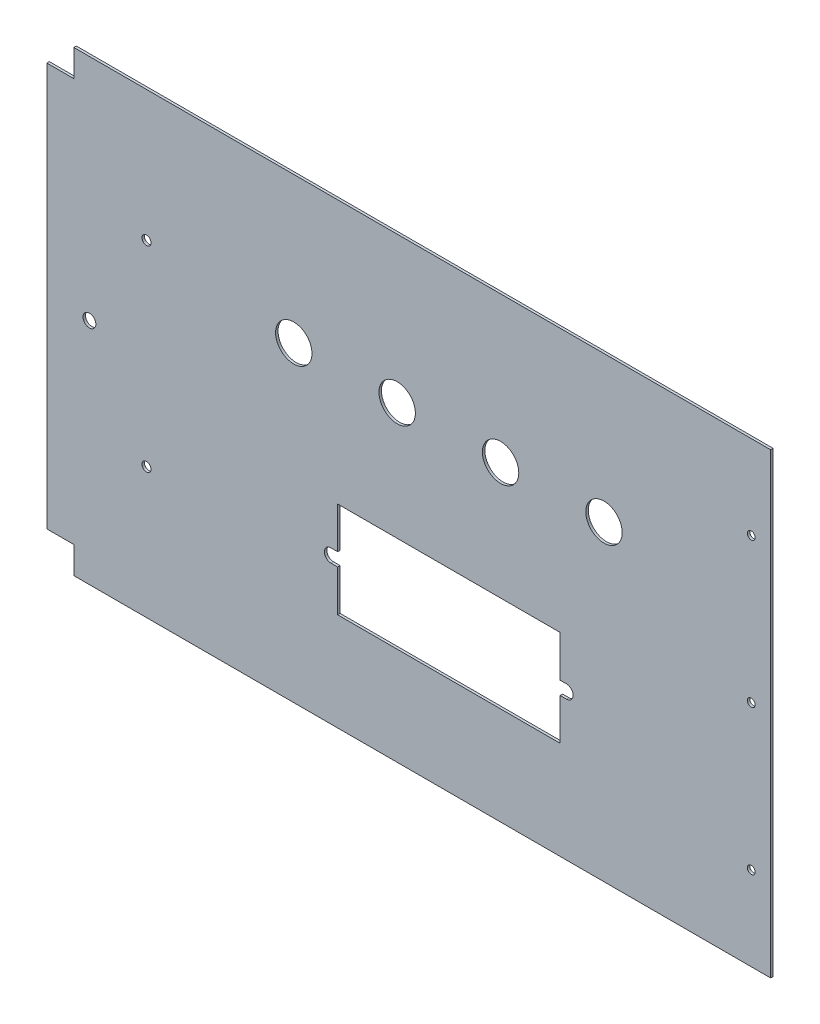
ISO-10303-21;
HEADER;
FILE_DESCRIPTION(('STEP AP214'),'2;1');
FILE_NAME('part.step','',(''),(''),'','','');
FILE_SCHEMA(('AUTOMOTIVE_DESIGN { 1 0 10303 214 1 1 1 1 }'));
ENDSEC;
DATA;
#1=APPLICATION_CONTEXT('core data for automotive mechanical design processes');
#2=APPLICATION_PROTOCOL_DEFINITION('international standard','automotive_design',2000,#1);
#3=PRODUCT_CONTEXT('',#1,'mechanical');
#4=PRODUCT('Part','Part','',(#3));
#5=PRODUCT_RELATED_PRODUCT_CATEGORY('part','',(#4));
#6=PRODUCT_DEFINITION_FORMATION('','',#4);
#7=PRODUCT_DEFINITION_CONTEXT('part definition',#1,'design');
#8=PRODUCT_DEFINITION('design','',#6,#7);
#9=PRODUCT_DEFINITION_SHAPE('','',#8);
#10=(LENGTH_UNIT() NAMED_UNIT(*) SI_UNIT(.MILLI.,.METRE.));
#11=(NAMED_UNIT(*) PLANE_ANGLE_UNIT() SI_UNIT($,.RADIAN.));
#12=(NAMED_UNIT(*) SI_UNIT($,.STERADIAN.) SOLID_ANGLE_UNIT());
#13=UNCERTAINTY_MEASURE_WITH_UNIT(LENGTH_MEASURE(1.E-05),#10,'distance_accuracy_value','');
#14=(GEOMETRIC_REPRESENTATION_CONTEXT(3) GLOBAL_UNCERTAINTY_ASSIGNED_CONTEXT((#13)) GLOBAL_UNIT_ASSIGNED_CONTEXT((#10,
#11,#12)) REPRESENTATION_CONTEXT('',''));
#15=CARTESIAN_POINT('',(0.,0.,0.));
#16=DIRECTION('',(0.,0.,1.));
#17=DIRECTION('',(1.,0.,0.));
#18=AXIS2_PLACEMENT_3D('',#15,#16,#17);
#19=CARTESIAN_POINT('',(-215.519,123.8758,-55.626));
#20=DIRECTION('',(0.,-1.,0.));
#21=DIRECTION('',(0.,0.,-1.));
#22=AXIS2_PLACEMENT_3D('',#19,#20,#21);
#23=PLANE('',#22);
#24=DIRECTION('',(1.,0.,0.));
#25=VECTOR('',#24,1.);
#26=CARTESIAN_POINT('',(0.,123.8758,-1.524));
#27=LINE('',#26,#25);
#28=CARTESIAN_POINT('',(-228.967962531012,123.8758,-1.52399999999989));
#29=VERTEX_POINT('',#28);
#30=CARTESIAN_POINT('',(-212.3948,123.8758,-1.524));
#31=VERTEX_POINT('',#30);
#32=EDGE_CURVE('E258',#29,#31,#27,.T.);
#33=ORIENTED_EDGE('',*,*,#32,.F.);
#34=DIRECTION('',(0.,0.,1.));
#35=VECTOR('',#34,1.);
#36=CARTESIAN_POINT('',(-228.967962531012,123.8758,1.11022302462516E-13));
#37=LINE('',#36,#35);
#38=CARTESIAN_POINT('',(-228.967962531012,123.8758,1.11022302462516E-13));
#39=VERTEX_POINT('',#38);
#40=EDGE_CURVE('E286',#29,#39,#37,.T.);
#41=ORIENTED_EDGE('',*,*,#40,.T.);
#42=DIRECTION('',(1.,0.,0.));
#43=VECTOR('',#42,1.);
#44=CARTESIAN_POINT('',(-215.519,123.8758,0.));
#45=LINE('',#44,#43);
#46=CARTESIAN_POINT('',(-212.3948,123.8758,0.));
#47=VERTEX_POINT('',#46);
#48=EDGE_CURVE('E326',#39,#47,#45,.T.);
#49=ORIENTED_EDGE('',*,*,#48,.T.);
#50=DIRECTION('',(0.,0.,1.));
#51=VECTOR('',#50,1.);
#52=CARTESIAN_POINT('',(-212.3948,123.8758,-55.626));
#53=LINE('',#52,#51);
#54=EDGE_CURVE('E327',#31,#47,#53,.T.);
#55=ORIENTED_EDGE('',*,*,#54,.F.);
#56=EDGE_LOOP('',(#33,#41,#49,#55));
#57=FACE_BOUND('',#56,.T.);
#58=ADVANCED_FACE('F113',(#57),#23,.F.);
#59=CARTESIAN_POINT('',(-212.3948,127.,-55.626));
#60=DIRECTION('',(1.,0.,0.));
#61=DIRECTION('',(0.,0.,-1.));
#62=AXIS2_PLACEMENT_3D('',#59,#60,#61);
#63=PLANE('',#62);
#64=DIRECTION('',(0.,1.,0.));
#65=VECTOR('',#64,1.);
#66=CARTESIAN_POINT('',(-212.3948,127.,0.));
#67=LINE('',#66,#65);
#68=CARTESIAN_POINT('',(-212.3948,140.448962531012,0.));
#69=VERTEX_POINT('',#68);
#70=EDGE_CURVE('E268',#47,#69,#67,.T.);
#71=ORIENTED_EDGE('',*,*,#70,.T.);
#72=DIRECTION('',(0.,0.,-1.));
#73=VECTOR('',#72,1.);
#74=CARTESIAN_POINT('',(-212.3948,140.448962531012,0.));
#75=LINE('',#74,#73);
#76=CARTESIAN_POINT('',(-212.3948,140.448962531012,-1.52399999999991));
#77=VERTEX_POINT('',#76);
#78=EDGE_CURVE('E265',#69,#77,#75,.T.);
#79=ORIENTED_EDGE('',*,*,#78,.T.);
#80=DIRECTION('',(0.,1.,0.));
#81=VECTOR('',#80,1.);
#82=CARTESIAN_POINT('',(-212.3948,0.,-1.524));
#83=LINE('',#82,#81);
#84=EDGE_CURVE('E251',#31,#77,#83,.T.);
#85=ORIENTED_EDGE('',*,*,#84,.F.);
#86=ORIENTED_EDGE('',*,*,#54,.T.);
#87=EDGE_LOOP('',(#71,#79,#85,#86));
#88=FACE_BOUND('',#87,.T.);
#89=ADVANCED_FACE('F266',(#88),#63,.F.);
#90=CARTESIAN_POINT('',(-212.3948,-123.8758,-55.626));
#91=DIRECTION('',(1.,0.,0.));
#92=DIRECTION('',(0.,0.,-1.));
#93=AXIS2_PLACEMENT_3D('',#90,#91,#92);
#94=PLANE('',#93);
#95=DIRECTION('',(0.,1.,0.));
#96=VECTOR('',#95,1.);
#97=CARTESIAN_POINT('',(-212.3948,0.,-1.524));
#98=LINE('',#97,#96);
#99=CARTESIAN_POINT('',(-212.3948,-140.448962531013,-1.52399999999986));
#100=VERTEX_POINT('',#99);
#101=CARTESIAN_POINT('',(-212.3948,-123.8758,-1.524));
#102=VERTEX_POINT('',#101);
#103=EDGE_CURVE('E455',#100,#102,#98,.T.);
#104=ORIENTED_EDGE('',*,*,#103,.F.);
#105=DIRECTION('',(0.,0.,1.));
#106=VECTOR('',#105,1.);
#107=CARTESIAN_POINT('',(-212.3948,-140.448962531013,1.38777878078145E-13));
#108=LINE('',#107,#106);
#109=CARTESIAN_POINT('',(-212.3948,-140.448962531013,0.));
#110=VERTEX_POINT('',#109);
#111=EDGE_CURVE('E301',#100,#110,#108,.T.);
#112=ORIENTED_EDGE('',*,*,#111,.T.);
#113=DIRECTION('',(0.,1.,0.));
#114=VECTOR('',#113,1.);
#115=CARTESIAN_POINT('',(-212.3948,-123.8758,0.));
#116=LINE('',#115,#114);
#117=CARTESIAN_POINT('',(-212.3948,-123.8758,0.));
#118=VERTEX_POINT('',#117);
#119=EDGE_CURVE('E330',#110,#118,#116,.T.);
#120=ORIENTED_EDGE('',*,*,#119,.T.);
#121=DIRECTION('',(0.,0.,1.));
#122=VECTOR('',#121,1.);
#123=CARTESIAN_POINT('',(-212.3948,-123.8758,-55.626));
#124=LINE('',#123,#122);
#125=EDGE_CURVE('E305',#102,#118,#124,.T.);
#126=ORIENTED_EDGE('',*,*,#125,.F.);
#127=EDGE_LOOP('',(#104,#112,#120,#126));
#128=FACE_BOUND('',#127,.T.);
#129=ADVANCED_FACE('F564',(#128),#94,.F.);
#130=CARTESIAN_POINT('',(-215.519,-123.8758,-55.626));
#131=DIRECTION('',(0.,1.,0.));
#132=DIRECTION('',(0.,0.,1.));
#133=AXIS2_PLACEMENT_3D('',#130,#131,#132);
#134=PLANE('',#133);
#135=DIRECTION('',(-1.,0.,0.));
#136=VECTOR('',#135,1.);
#137=CARTESIAN_POINT('',(-215.519,-123.8758,0.));
#138=LINE('',#137,#136);
#139=CARTESIAN_POINT('',(-228.967962531012,-123.8758,0.));
#140=VERTEX_POINT('',#139);
#141=EDGE_CURVE('E338',#118,#140,#138,.T.);
#142=ORIENTED_EDGE('',*,*,#141,.T.);
#143=DIRECTION('',(0.,0.,-1.));
#144=VECTOR('',#143,1.);
#145=CARTESIAN_POINT('',(-228.967962531012,-123.8758,1.11022302462516E-13));
#146=LINE('',#145,#144);
#147=CARTESIAN_POINT('',(-228.967962531012,-123.8758,-1.52399999999989));
#148=VERTEX_POINT('',#147);
#149=EDGE_CURVE('E291',#140,#148,#146,.T.);
#150=ORIENTED_EDGE('',*,*,#149,.T.);
#151=DIRECTION('',(-1.,0.,0.));
#152=VECTOR('',#151,1.);
#153=CARTESIAN_POINT('',(0.,-123.8758,-1.524));
#154=LINE('',#153,#152);
#155=EDGE_CURVE('E459',#102,#148,#154,.T.);
#156=ORIENTED_EDGE('',*,*,#155,.F.);
#157=ORIENTED_EDGE('',*,*,#125,.T.);
#158=EDGE_LOOP('',(#142,#150,#156,#157));
#159=FACE_BOUND('',#158,.T.);
#160=ADVANCED_FACE('F568',(#159),#134,.F.);
#161=CARTESIAN_POINT('',(0.,0.,-1.524));
#162=DIRECTION('',(0.,0.,1.));
#163=DIRECTION('',(1.,0.,0.));
#164=AXIS2_PLACEMENT_3D('',#161,#162,#163);
#165=PLANE('',#164);
#166=CARTESIAN_POINT('',(203.581,88.8999999999999,-1.524));
#167=DIRECTION('',(0.,0.,1.));
#168=DIRECTION('',(1.,0.,0.));
#169=AXIS2_PLACEMENT_3D('',#166,#167,#168);
#170=CIRCLE('',#169,2.41299999999999);
#171=CARTESIAN_POINT('',(205.994,88.8999999999999,-1.524));
#172=VERTEX_POINT('',#171);
#173=EDGE_CURVE('E547',#172,#172,#170,.T.);
#174=ORIENTED_EDGE('',*,*,#173,.T.);
#175=EDGE_LOOP('',(#174));
#176=FACE_BOUND('',#175,.T.);
#177=CARTESIAN_POINT('',(203.581,-88.9000000000001,-1.524));
#178=DIRECTION('',(0.,0.,1.));
#179=DIRECTION('',(1.,0.,0.));
#180=AXIS2_PLACEMENT_3D('',#177,#178,#179);
#181=CIRCLE('',#180,2.41299999999999);
#182=CARTESIAN_POINT('',(205.994,-88.9000000000001,-1.524));
#183=VERTEX_POINT('',#182);
#184=EDGE_CURVE('E543',#183,#183,#181,.T.);
#185=ORIENTED_EDGE('',*,*,#184,.T.);
#186=EDGE_LOOP('',(#185));
#187=FACE_BOUND('',#186,.T.);
#188=CARTESIAN_POINT('',(203.581,0.,-1.524));
#189=DIRECTION('',(0.,0.,1.));
#190=DIRECTION('',(1.,0.,0.));
#191=AXIS2_PLACEMENT_3D('',#188,#189,#190);
#192=CIRCLE('',#191,2.413);
#193=CARTESIAN_POINT('',(205.994,0.,-1.524));
#194=VERTEX_POINT('',#193);
#195=EDGE_CURVE('E539',#194,#194,#192,.T.);
#196=ORIENTED_EDGE('',*,*,#195,.T.);
#197=EDGE_LOOP('',(#196));
#198=FACE_BOUND('',#197,.T.);
#199=CARTESIAN_POINT('',(-167.767,-60.1980000000001,-1.524));
#200=DIRECTION('',(0.,0.,1.));
#201=DIRECTION('',(1.,0.,0.));
#202=AXIS2_PLACEMENT_3D('',#199,#200,#201);
#203=CIRCLE('',#202,2.79399999999998);
#204=CARTESIAN_POINT('',(-164.973,-60.1980000000001,-1.524));
#205=VERTEX_POINT('',#204);
#206=EDGE_CURVE('E535',#205,#205,#203,.T.);
#207=ORIENTED_EDGE('',*,*,#206,.T.);
#208=EDGE_LOOP('',(#207));
#209=FACE_BOUND('',#208,.T.);
#210=CARTESIAN_POINT('',(49.6570000000001,50.7999999999995,-1.524));
#211=DIRECTION('',(0.,0.,1.));
#212=DIRECTION('',(1.,0.,0.));
#213=AXIS2_PLACEMENT_3D('',#210,#211,#212);
#214=CIRCLE('',#213,11.176);
#215=CARTESIAN_POINT('',(60.8330000000001,50.7999999999995,-1.524));
#216=VERTEX_POINT('',#215);
#217=EDGE_CURVE('E531',#216,#216,#214,.T.);
#218=ORIENTED_EDGE('',*,*,#217,.T.);
#219=EDGE_LOOP('',(#218));
#220=FACE_BOUND('',#219,.T.);
#221=CARTESIAN_POINT('',(-13.8429999999999,50.7999999999991,-1.524));
#222=DIRECTION('',(0.,0.,1.));
#223=DIRECTION('',(1.,0.,0.));
#224=AXIS2_PLACEMENT_3D('',#221,#222,#223);
#225=CIRCLE('',#224,11.176);
#226=CARTESIAN_POINT('',(-2.66699999999994,50.7999999999991,-1.524));
#227=VERTEX_POINT('',#226);
#228=EDGE_CURVE('E527',#227,#227,#225,.T.);
#229=ORIENTED_EDGE('',*,*,#228,.T.);
#230=EDGE_LOOP('',(#229));
#231=FACE_BOUND('',#230,.T.);
#232=CARTESIAN_POINT('',(-77.3429999999999,50.7999999999986,-1.524));
#233=DIRECTION('',(0.,0.,1.));
#234=DIRECTION('',(1.,0.,0.));
#235=AXIS2_PLACEMENT_3D('',#232,#233,#234);
#236=CIRCLE('',#235,11.176);
#237=CARTESIAN_POINT('',(-66.1669999999999,50.7999999999986,-1.524));
#238=VERTEX_POINT('',#237);
#239=EDGE_CURVE('E523',#238,#238,#236,.T.);
#240=ORIENTED_EDGE('',*,*,#239,.T.);
#241=EDGE_LOOP('',(#240));
#242=FACE_BOUND('',#241,.T.);
#243=DIRECTION('',(1.,0.,0.));
#244=VECTOR('',#243,1.);
#245=CARTESIAN_POINT('',(0.,-80.2640000000001,-1.524));
#246=LINE('',#245,#244);
#247=CARTESIAN_POINT('',(-50.4189999999999,-80.2640000000001,-1.524));
#248=VERTEX_POINT('',#247);
#249=CARTESIAN_POINT('',(86.2330000000001,-80.2640000000001,-1.524));
#250=VERTEX_POINT('',#249);
#251=EDGE_CURVE('E515',#248,#250,#246,.T.);
#252=ORIENTED_EDGE('',*,*,#251,.T.);
#253=DIRECTION('',(0.,1.,0.));
#254=VECTOR('',#253,1.);
#255=CARTESIAN_POINT('',(86.233,0.,-1.524));
#256=LINE('',#255,#254);
#257=CARTESIAN_POINT('',(86.233,-54.8640000000001,-1.524));
#258=VERTEX_POINT('',#257);
#259=EDGE_CURVE('E519',#250,#258,#256,.T.);
#260=ORIENTED_EDGE('',*,*,#259,.T.);
#261=DIRECTION('',(1.,0.,0.));
#262=VECTOR('',#261,1.);
#263=CARTESIAN_POINT('',(0.,-54.8640000000001,-1.524));
#264=LINE('',#263,#262);
#265=CARTESIAN_POINT('',(90.1225329554717,-54.8640000000001,-1.524));
#266=VERTEX_POINT('',#265);
#267=EDGE_CURVE('E475',#258,#266,#264,.T.);
#268=ORIENTED_EDGE('',*,*,#267,.T.);
#269=CARTESIAN_POINT('',(90.1225329554717,-50.8000000000001,-1.524));
#270=DIRECTION('',(0.,0.,1.));
#271=DIRECTION('',(1.,0.,0.));
#272=AXIS2_PLACEMENT_3D('',#269,#270,#271);
#273=CIRCLE('',#272,4.064);
#274=CARTESIAN_POINT('',(90.1225329554716,-46.7360000000001,-1.524));
#275=VERTEX_POINT('',#274);
#276=EDGE_CURVE('E479',#266,#275,#273,.T.);
#277=ORIENTED_EDGE('',*,*,#276,.T.);
#278=DIRECTION('',(-1.,0.,0.));
#279=VECTOR('',#278,1.);
#280=CARTESIAN_POINT('',(0.,-46.7360000000001,-1.524));
#281=LINE('',#280,#279);
#282=CARTESIAN_POINT('',(86.233,-46.7360000000001,-1.524));
#283=VERTEX_POINT('',#282);
#284=EDGE_CURVE('E483',#275,#283,#281,.T.);
#285=ORIENTED_EDGE('',*,*,#284,.T.);
#286=DIRECTION('',(0.,1.,0.));
#287=VECTOR('',#286,1.);
#288=CARTESIAN_POINT('',(86.233,0.,-1.524));
#289=LINE('',#288,#287);
#290=CARTESIAN_POINT('',(86.233,-21.3360000000001,-1.524));
#291=VERTEX_POINT('',#290);
#292=EDGE_CURVE('E487',#283,#291,#289,.T.);
#293=ORIENTED_EDGE('',*,*,#292,.T.);
#294=DIRECTION('',(-1.,0.,0.));
#295=VECTOR('',#294,1.);
#296=CARTESIAN_POINT('',(0.,-21.3360000000001,-1.524));
#297=LINE('',#296,#295);
#298=CARTESIAN_POINT('',(-50.4189999999999,-21.3360000000001,-1.524));
#299=VERTEX_POINT('',#298);
#300=EDGE_CURVE('E491',#291,#299,#297,.T.);
#301=ORIENTED_EDGE('',*,*,#300,.T.);
#302=DIRECTION('',(0.,-1.,0.));
#303=VECTOR('',#302,1.);
#304=CARTESIAN_POINT('',(-50.4189999999999,0.,-1.524));
#305=LINE('',#304,#303);
#306=CARTESIAN_POINT('',(-50.4189999999999,-46.7360000000001,-1.524));
#307=VERTEX_POINT('',#306);
#308=EDGE_CURVE('E495',#299,#307,#305,.T.);
#309=ORIENTED_EDGE('',*,*,#308,.T.);
#310=DIRECTION('',(-1.,0.,0.));
#311=VECTOR('',#310,1.);
#312=CARTESIAN_POINT('',(0.,-46.7360000000001,-1.524));
#313=LINE('',#312,#311);
#314=CARTESIAN_POINT('',(-54.4829999999999,-46.7360000000001,-1.524));
#315=VERTEX_POINT('',#314);
#316=EDGE_CURVE('E499',#307,#315,#313,.T.);
#317=ORIENTED_EDGE('',*,*,#316,.T.);
#318=CARTESIAN_POINT('',(-54.4829999999999,-50.8000000000001,-1.524));
#319=DIRECTION('',(0.,0.,1.));
#320=DIRECTION('',(1.,0.,0.));
#321=AXIS2_PLACEMENT_3D('',#318,#319,#320);
#322=CIRCLE('',#321,4.064);
#323=CARTESIAN_POINT('',(-54.4829999999999,-54.8640000000001,-1.524));
#324=VERTEX_POINT('',#323);
#325=EDGE_CURVE('E503',#315,#324,#322,.T.);
#326=ORIENTED_EDGE('',*,*,#325,.T.);
#327=DIRECTION('',(1.,0.,0.));
#328=VECTOR('',#327,1.);
#329=CARTESIAN_POINT('',(0.,-54.8640000000001,-1.524));
#330=LINE('',#329,#328);
#331=CARTESIAN_POINT('',(-50.4189999999999,-54.8640000000001,-1.524));
#332=VERTEX_POINT('',#331);
#333=EDGE_CURVE('E507',#324,#332,#330,.T.);
#334=ORIENTED_EDGE('',*,*,#333,.T.);
#335=DIRECTION('',(0.,-1.,0.));
#336=VECTOR('',#335,1.);
#337=CARTESIAN_POINT('',(-50.4189999999999,0.,-1.524));
#338=LINE('',#337,#336);
#339=EDGE_CURVE('E511',#332,#248,#338,.T.);
#340=ORIENTED_EDGE('',*,*,#339,.T.);
#341=EDGE_LOOP('',(#252,#260,#268,#277,#285,#293,#301,#309,#317,#326,#334,#340));
#342=FACE_BOUND('',#341,.T.);
#343=CARTESIAN_POINT('',(-167.767,60.1979999999999,-1.524));
#344=DIRECTION('',(0.,0.,1.));
#345=DIRECTION('',(1.,0.,0.));
#346=AXIS2_PLACEMENT_3D('',#343,#344,#345);
#347=CIRCLE('',#346,2.79399999999998);
#348=CARTESIAN_POINT('',(-164.973,60.1979999999999,-1.524));
#349=VERTEX_POINT('',#348);
#350=EDGE_CURVE('E471',#349,#349,#347,.T.);
#351=ORIENTED_EDGE('',*,*,#350,.T.);
#352=EDGE_LOOP('',(#351));
#353=FACE_BOUND('',#352,.T.);
#354=CARTESIAN_POINT('',(-202.819,-1.49880108324396E-12,-1.524));
#355=DIRECTION('',(0.,0.,1.));
#356=DIRECTION('',(1.,0.,0.));
#357=AXIS2_PLACEMENT_3D('',#354,#355,#356);
#358=CIRCLE('',#357,3.937);
#359=CARTESIAN_POINT('',(-198.882,-1.49880108324396E-12,-1.524));
#360=VERTEX_POINT('',#359);
#361=EDGE_CURVE('E467',#360,#360,#358,.T.);
#362=ORIENTED_EDGE('',*,*,#361,.T.);
#363=EDGE_LOOP('',(#362));
#364=FACE_BOUND('',#363,.T.);
#365=CARTESIAN_POINT('',(113.157,50.8,-1.524));
#366=DIRECTION('',(0.,0.,1.));
#367=DIRECTION('',(1.,0.,0.));
#368=AXIS2_PLACEMENT_3D('',#365,#366,#367);
#369=CIRCLE('',#368,11.176);
#370=CARTESIAN_POINT('',(124.333,50.8,-1.524));
#371=VERTEX_POINT('',#370);
#372=EDGE_CURVE('E262',#371,#371,#369,.T.);
#373=ORIENTED_EDGE('',*,*,#372,.T.);
#374=EDGE_LOOP('',(#373));
#375=FACE_BOUND('',#374,.T.);
#376=ORIENTED_EDGE('',*,*,#32,.T.);
#377=ORIENTED_EDGE('',*,*,#84,.T.);
#378=DIRECTION('',(-1.,0.,0.));
#379=VECTOR('',#378,1.);
#380=CARTESIAN_POINT('',(0.,140.448962531012,-1.52399999999989));
#381=LINE('',#380,#379);
#382=CARTESIAN_POINT('',(215.519,140.448962531013,-1.52399999999986));
#383=VERTEX_POINT('',#382);
#384=EDGE_CURVE('E255',#77,#383,#381,.F.);
#385=ORIENTED_EDGE('',*,*,#384,.T.);
#386=DIRECTION('',(0.,1.,0.));
#387=VECTOR('',#386,1.);
#388=CARTESIAN_POINT('',(215.519,127.,-1.524));
#389=LINE('',#388,#387);
#390=CARTESIAN_POINT('',(215.519,-140.448962531012,-1.52399999999991));
#391=VERTEX_POINT('',#390);
#392=EDGE_CURVE('E13',#391,#383,#389,.T.);
#393=ORIENTED_EDGE('',*,*,#392,.F.);
#394=DIRECTION('',(-1.,0.,0.));
#395=VECTOR('',#394,1.);
#396=CARTESIAN_POINT('',(0.,-140.448962531013,-1.52399999999989));
#397=LINE('',#396,#395);
#398=EDGE_CURVE('E310',#391,#100,#397,.T.);
#399=ORIENTED_EDGE('',*,*,#398,.T.);
#400=ORIENTED_EDGE('',*,*,#103,.T.);
#401=ORIENTED_EDGE('',*,*,#155,.T.);
#402=DIRECTION('',(0.,1.,0.));
#403=VECTOR('',#402,1.);
#404=CARTESIAN_POINT('',(-228.967962531012,0.,-1.52399999999989));
#405=LINE('',#404,#403);
#406=EDGE_CURVE('E295',#148,#29,#405,.T.);
#407=ORIENTED_EDGE('',*,*,#406,.T.);
#408=EDGE_LOOP('',(#376,#377,#385,#393,#399,#400,#401,#407));
#409=FACE_BOUND('',#408,.T.);
#410=ADVANCED_FACE('F253',(#176,#187,#198,#209,#220,#231,#242,#342,#353,#364,#375,#409),#165,.F.);
#411=CARTESIAN_POINT('',(0.,0.,0.));
#412=DIRECTION('',(0.,0.,1.));
#413=DIRECTION('',(1.,0.,0.));
#414=AXIS2_PLACEMENT_3D('',#411,#412,#413);
#415=PLANE('',#414);
#416=CARTESIAN_POINT('',(203.581,88.8999999999999,0.));
#417=DIRECTION('',(0.,0.,1.));
#418=DIRECTION('',(1.,0.,0.));
#419=AXIS2_PLACEMENT_3D('',#416,#417,#418);
#420=CIRCLE('',#419,2.41299999999999);
#421=CARTESIAN_POINT('',(205.994,88.8999999999999,0.));
#422=VERTEX_POINT('',#421);
#423=EDGE_CURVE('E352',#422,#422,#420,.T.);
#424=ORIENTED_EDGE('',*,*,#423,.F.);
#425=EDGE_LOOP('',(#424));
#426=FACE_BOUND('',#425,.T.);
#427=CARTESIAN_POINT('',(203.581,-88.9000000000001,0.));
#428=DIRECTION('',(0.,0.,1.));
#429=DIRECTION('',(1.,0.,0.));
#430=AXIS2_PLACEMENT_3D('',#427,#428,#429);
#431=CIRCLE('',#430,2.41299999999999);
#432=CARTESIAN_POINT('',(205.994,-88.9000000000001,0.));
#433=VERTEX_POINT('',#432);
#434=EDGE_CURVE('E348',#433,#433,#431,.T.);
#435=ORIENTED_EDGE('',*,*,#434,.F.);
#436=EDGE_LOOP('',(#435));
#437=FACE_BOUND('',#436,.T.);
#438=CARTESIAN_POINT('',(203.581,0.,0.));
#439=DIRECTION('',(0.,0.,1.));
#440=DIRECTION('',(1.,0.,0.));
#441=AXIS2_PLACEMENT_3D('',#438,#439,#440);
#442=CIRCLE('',#441,2.413);
#443=CARTESIAN_POINT('',(205.994,0.,0.));
#444=VERTEX_POINT('',#443);
#445=EDGE_CURVE('E344',#444,#444,#442,.T.);
#446=ORIENTED_EDGE('',*,*,#445,.F.);
#447=EDGE_LOOP('',(#446));
#448=FACE_BOUND('',#447,.T.);
#449=CARTESIAN_POINT('',(-167.767,-60.1980000000001,0.));
#450=DIRECTION('',(0.,0.,1.));
#451=DIRECTION('',(1.,0.,0.));
#452=AXIS2_PLACEMENT_3D('',#449,#450,#451);
#453=CIRCLE('',#452,2.79399999999998);
#454=CARTESIAN_POINT('',(-164.973,-60.1980000000001,0.));
#455=VERTEX_POINT('',#454);
#456=EDGE_CURVE('E321',#455,#455,#453,.T.);
#457=ORIENTED_EDGE('',*,*,#456,.F.);
#458=EDGE_LOOP('',(#457));
#459=FACE_BOUND('',#458,.T.);
#460=CARTESIAN_POINT('',(49.6570000000001,50.7999999999995,0.));
#461=DIRECTION('',(0.,0.,1.));
#462=DIRECTION('',(1.,0.,0.));
#463=AXIS2_PLACEMENT_3D('',#460,#461,#462);
#464=CIRCLE('',#463,11.176);
#465=CARTESIAN_POINT('',(60.8330000000001,50.7999999999995,0.));
#466=VERTEX_POINT('',#465);
#467=EDGE_CURVE('E444',#466,#466,#464,.T.);
#468=ORIENTED_EDGE('',*,*,#467,.F.);
#469=EDGE_LOOP('',(#468));
#470=FACE_BOUND('',#469,.T.);
#471=CARTESIAN_POINT('',(-13.8429999999999,50.7999999999991,0.));
#472=DIRECTION('',(0.,0.,1.));
#473=DIRECTION('',(1.,0.,0.));
#474=AXIS2_PLACEMENT_3D('',#471,#472,#473);
#475=CIRCLE('',#474,11.176);
#476=CARTESIAN_POINT('',(-2.66699999999994,50.7999999999991,0.));
#477=VERTEX_POINT('',#476);
#478=EDGE_CURVE('E364',#477,#477,#475,.T.);
#479=ORIENTED_EDGE('',*,*,#478,.F.);
#480=EDGE_LOOP('',(#479));
#481=FACE_BOUND('',#480,.T.);
#482=CARTESIAN_POINT('',(-77.3429999999999,50.7999999999986,0.));
#483=DIRECTION('',(0.,0.,1.));
#484=DIRECTION('',(1.,0.,0.));
#485=AXIS2_PLACEMENT_3D('',#482,#483,#484);
#486=CIRCLE('',#485,11.176);
#487=CARTESIAN_POINT('',(-66.1669999999999,50.7999999999986,0.));
#488=VERTEX_POINT('',#487);
#489=EDGE_CURVE('E360',#488,#488,#486,.T.);
#490=ORIENTED_EDGE('',*,*,#489,.F.);
#491=EDGE_LOOP('',(#490));
#492=FACE_BOUND('',#491,.T.);
#493=DIRECTION('',(0.,1.,0.));
#494=VECTOR('',#493,1.);
#495=CARTESIAN_POINT('',(86.233,-54.8640000000001,0.));
#496=LINE('',#495,#494);
#497=CARTESIAN_POINT('',(86.2330000000001,-80.2640000000001,0.));
#498=VERTEX_POINT('',#497);
#499=CARTESIAN_POINT('',(86.233,-54.8640000000001,0.));
#500=VERTEX_POINT('',#499);
#501=EDGE_CURVE('E137',#498,#500,#496,.T.);
#502=ORIENTED_EDGE('',*,*,#501,.F.);
#503=DIRECTION('',(1.,0.,0.));
#504=VECTOR('',#503,1.);
#505=CARTESIAN_POINT('',(-50.4189999999999,-80.2640000000001,0.));
#506=LINE('',#505,#504);
#507=CARTESIAN_POINT('',(-50.4189999999999,-80.2640000000001,0.));
#508=VERTEX_POINT('',#507);
#509=EDGE_CURVE('E368',#508,#498,#506,.T.);
#510=ORIENTED_EDGE('',*,*,#509,.F.);
#511=DIRECTION('',(0.,-1.,0.));
#512=VECTOR('',#511,1.);
#513=CARTESIAN_POINT('',(-50.4189999999999,-54.8640000000001,0.));
#514=LINE('',#513,#512);
#515=CARTESIAN_POINT('',(-50.4189999999999,-54.8640000000001,0.));
#516=VERTEX_POINT('',#515);
#517=EDGE_CURVE('E403',#516,#508,#514,.T.);
#518=ORIENTED_EDGE('',*,*,#517,.F.);
#519=DIRECTION('',(1.,0.,0.));
#520=VECTOR('',#519,1.);
#521=CARTESIAN_POINT('',(-54.4829999999999,-54.8640000000001,0.));
#522=LINE('',#521,#520);
#523=CARTESIAN_POINT('',(-54.4829999999999,-54.8640000000001,0.));
#524=VERTEX_POINT('',#523);
#525=EDGE_CURVE('E407',#524,#516,#522,.T.);
#526=ORIENTED_EDGE('',*,*,#525,.F.);
#527=CARTESIAN_POINT('',(-54.4829999999999,-50.8000000000001,0.));
#528=DIRECTION('',(0.,0.,1.));
#529=DIRECTION('',(1.,0.,0.));
#530=AXIS2_PLACEMENT_3D('',#527,#528,#529);
#531=CIRCLE('',#530,4.064);
#532=CARTESIAN_POINT('',(-54.4829999999999,-46.7360000000001,0.));
#533=VERTEX_POINT('',#532);
#534=EDGE_CURVE('E411',#533,#524,#531,.T.);
#535=ORIENTED_EDGE('',*,*,#534,.F.);
#536=DIRECTION('',(-1.,0.,0.));
#537=VECTOR('',#536,1.);
#538=CARTESIAN_POINT('',(-54.4829999999999,-46.7360000000001,0.));
#539=LINE('',#538,#537);
#540=CARTESIAN_POINT('',(-50.4189999999999,-46.7360000000001,0.));
#541=VERTEX_POINT('',#540);
#542=EDGE_CURVE('E415',#541,#533,#539,.T.);
#543=ORIENTED_EDGE('',*,*,#542,.F.);
#544=DIRECTION('',(0.,-1.,0.));
#545=VECTOR('',#544,1.);
#546=CARTESIAN_POINT('',(-50.4189999999999,-21.3360000000001,0.));
#547=LINE('',#546,#545);
#548=CARTESIAN_POINT('',(-50.4189999999999,-21.3360000000001,0.));
#549=VERTEX_POINT('',#548);
#550=EDGE_CURVE('E419',#549,#541,#547,.T.);
#551=ORIENTED_EDGE('',*,*,#550,.F.);
#552=DIRECTION('',(-1.,0.,0.));
#553=VECTOR('',#552,1.);
#554=CARTESIAN_POINT('',(-50.4189999999999,-21.3360000000001,0.));
#555=LINE('',#554,#553);
#556=CARTESIAN_POINT('',(86.233,-21.3360000000001,0.));
#557=VERTEX_POINT('',#556);
#558=EDGE_CURVE('E423',#557,#549,#555,.T.);
#559=ORIENTED_EDGE('',*,*,#558,.F.);
#560=DIRECTION('',(0.,1.,0.));
#561=VECTOR('',#560,1.);
#562=CARTESIAN_POINT('',(86.233,-21.3360000000001,0.));
#563=LINE('',#562,#561);
#564=CARTESIAN_POINT('',(86.233,-46.7360000000001,0.));
#565=VERTEX_POINT('',#564);
#566=EDGE_CURVE('E427',#565,#557,#563,.T.);
#567=ORIENTED_EDGE('',*,*,#566,.F.);
#568=DIRECTION('',(-1.,0.,0.));
#569=VECTOR('',#568,1.);
#570=CARTESIAN_POINT('',(86.233,-46.7360000000001,0.));
#571=LINE('',#570,#569);
#572=CARTESIAN_POINT('',(90.1225329554716,-46.7360000000001,0.));
#573=VERTEX_POINT('',#572);
#574=EDGE_CURVE('E431',#573,#565,#571,.T.);
#575=ORIENTED_EDGE('',*,*,#574,.F.);
#576=CARTESIAN_POINT('',(90.1225329554717,-50.8000000000001,0.));
#577=DIRECTION('',(0.,0.,1.));
#578=DIRECTION('',(1.,0.,0.));
#579=AXIS2_PLACEMENT_3D('',#576,#577,#578);
#580=CIRCLE('',#579,4.064);
#581=CARTESIAN_POINT('',(90.1225329554717,-54.8640000000001,0.));
#582=VERTEX_POINT('',#581);
#583=EDGE_CURVE('E435',#582,#573,#580,.T.);
#584=ORIENTED_EDGE('',*,*,#583,.F.);
#585=DIRECTION('',(1.,0.,0.));
#586=VECTOR('',#585,1.);
#587=CARTESIAN_POINT('',(86.233,-54.8640000000001,0.));
#588=LINE('',#587,#586);
#589=EDGE_CURVE('E439',#500,#582,#588,.T.);
#590=ORIENTED_EDGE('',*,*,#589,.F.);
#591=EDGE_LOOP('',(#502,#510,#518,#526,#535,#543,#551,#559,#567,#575,#584,#590));
#592=FACE_BOUND('',#591,.T.);
#593=CARTESIAN_POINT('',(-167.767,60.1979999999999,0.));
#594=DIRECTION('',(0.,0.,1.));
#595=DIRECTION('',(1.,0.,0.));
#596=AXIS2_PLACEMENT_3D('',#593,#594,#595);
#597=CIRCLE('',#596,2.79399999999998);
#598=CARTESIAN_POINT('',(-164.973,60.1979999999999,0.));
#599=VERTEX_POINT('',#598);
#600=EDGE_CURVE('E317',#599,#599,#597,.T.);
#601=ORIENTED_EDGE('',*,*,#600,.F.);
#602=EDGE_LOOP('',(#601));
#603=FACE_BOUND('',#602,.T.);
#604=CARTESIAN_POINT('',(-202.819,-1.49880108324396E-12,0.));
#605=DIRECTION('',(0.,0.,1.));
#606=DIRECTION('',(1.,0.,0.));
#607=AXIS2_PLACEMENT_3D('',#604,#605,#606);
#608=CIRCLE('',#607,3.937);
#609=CARTESIAN_POINT('',(-198.882,-1.49880108324396E-12,0.));
#610=VERTEX_POINT('',#609);
#611=EDGE_CURVE('E322',#610,#610,#608,.T.);
#612=ORIENTED_EDGE('',*,*,#611,.F.);
#613=EDGE_LOOP('',(#612));
#614=FACE_BOUND('',#613,.T.);
#615=ORIENTED_EDGE('',*,*,#70,.F.);
#616=ORIENTED_EDGE('',*,*,#48,.F.);
#617=DIRECTION('',(0.,-1.,0.));
#618=VECTOR('',#617,1.);
#619=CARTESIAN_POINT('',(-228.967962531012,-127.,1.11022302462516E-13));
#620=LINE('',#619,#618);
#621=EDGE_CURVE('E273',#140,#39,#620,.F.);
#622=ORIENTED_EDGE('',*,*,#621,.F.);
#623=ORIENTED_EDGE('',*,*,#141,.F.);
#624=ORIENTED_EDGE('',*,*,#119,.F.);
#625=DIRECTION('',(1.,0.,0.));
#626=VECTOR('',#625,1.);
#627=CARTESIAN_POINT('',(215.519,-140.448962531012,0.));
#628=LINE('',#627,#626);
#629=CARTESIAN_POINT('',(215.519,-140.448962531012,0.));
#630=VERTEX_POINT('',#629);
#631=EDGE_CURVE('E290',#630,#110,#628,.F.);
#632=ORIENTED_EDGE('',*,*,#631,.F.);
#633=DIRECTION('',(0.,1.,0.));
#634=VECTOR('',#633,1.);
#635=CARTESIAN_POINT('',(215.519,127.,0.));
#636=LINE('',#635,#634);
#637=CARTESIAN_POINT('',(215.519,140.448962531012,1.38777878078145E-13));
#638=VERTEX_POINT('',#637);
#639=EDGE_CURVE('E117',#630,#638,#636,.T.);
#640=ORIENTED_EDGE('',*,*,#639,.T.);
#641=DIRECTION('',(1.,0.,0.));
#642=VECTOR('',#641,1.);
#643=CARTESIAN_POINT('',(215.519,140.448962531012,1.38777878078145E-13));
#644=LINE('',#643,#642);
#645=EDGE_CURVE('E281',#69,#638,#644,.T.);
#646=ORIENTED_EDGE('',*,*,#645,.F.);
#647=EDGE_LOOP('',(#615,#616,#622,#623,#624,#632,#640,#646));
#648=FACE_BOUND('',#647,.T.);
#649=CARTESIAN_POINT('',(113.157,50.8,0.));
#650=DIRECTION('',(0.,0.,1.));
#651=DIRECTION('',(1.,0.,0.));
#652=AXIS2_PLACEMENT_3D('',#649,#650,#651);
#653=CIRCLE('',#652,11.176);
#654=CARTESIAN_POINT('',(124.333,50.8,0.));
#655=VERTEX_POINT('',#654);
#656=EDGE_CURVE('E448',#655,#655,#653,.T.);
#657=ORIENTED_EDGE('',*,*,#656,.F.);
#658=EDGE_LOOP('',(#657));
#659=FACE_BOUND('',#658,.T.);
#660=ADVANCED_FACE('F115',(#426,#437,#448,#459,#470,#481,#492,#592,#603,#614,#648,#659),#415,.T.);
#661=CARTESIAN_POINT('',(215.519,127.,-1.524));
#662=DIRECTION('',(1.,0.,0.));
#663=DIRECTION('',(0.,1.,0.));
#664=AXIS2_PLACEMENT_3D('',#661,#662,#663);
#665=PLANE('',#664);
#666=ORIENTED_EDGE('',*,*,#639,.F.);
#667=DIRECTION('',(0.,0.,-1.));
#668=VECTOR('',#667,1.);
#669=CARTESIAN_POINT('',(215.519,-140.448962531012,0.));
#670=LINE('',#669,#668);
#671=EDGE_CURVE('E306',#630,#391,#670,.T.);
#672=ORIENTED_EDGE('',*,*,#671,.T.);
#673=ORIENTED_EDGE('',*,*,#392,.T.);
#674=DIRECTION('',(0.,0.,-1.));
#675=VECTOR('',#674,1.);
#676=CARTESIAN_POINT('',(215.519,140.448962531012,1.38777878078145E-13));
#677=LINE('',#676,#675);
#678=EDGE_CURVE('E277',#638,#383,#677,.T.);
#679=ORIENTED_EDGE('',*,*,#678,.F.);
#680=EDGE_LOOP('',(#666,#672,#673,#679));
#681=FACE_BOUND('',#680,.T.);
#682=ADVANCED_FACE('F558',(#681),#665,.T.);
#683=CARTESIAN_POINT('',(113.157,50.8,-55.626));
#684=DIRECTION('',(0.,0.,1.));
#685=DIRECTION('',(1.,0.,0.));
#686=AXIS2_PLACEMENT_3D('',#683,#684,#685);
#687=CYLINDRICAL_SURFACE('',#686,11.176);
#688=ORIENTED_EDGE('',*,*,#656,.T.);
#689=EDGE_LOOP('',(#688));
#690=FACE_BOUND('',#689,.T.);
#691=ORIENTED_EDGE('',*,*,#372,.F.);
#692=EDGE_LOOP('',(#691));
#693=FACE_BOUND('',#692,.T.);
#694=ADVANCED_FACE('F588',(#690,#693),#687,.F.);
#695=CARTESIAN_POINT('',(-202.819,-1.49880108324396E-12,-55.626));
#696=DIRECTION('',(0.,0.,1.));
#697=DIRECTION('',(1.,0.,0.));
#698=AXIS2_PLACEMENT_3D('',#695,#696,#697);
#699=CYLINDRICAL_SURFACE('',#698,3.937);
#700=ORIENTED_EDGE('',*,*,#611,.T.);
#701=EDGE_LOOP('',(#700));
#702=FACE_BOUND('',#701,.T.);
#703=ORIENTED_EDGE('',*,*,#361,.F.);
#704=EDGE_LOOP('',(#703));
#705=FACE_BOUND('',#704,.T.);
#706=ADVANCED_FACE('F593',(#702,#705),#699,.F.);
#707=CARTESIAN_POINT('',(-167.767,60.1979999999999,-55.626));
#708=DIRECTION('',(0.,0.,1.));
#709=DIRECTION('',(1.,0.,0.));
#710=AXIS2_PLACEMENT_3D('',#707,#708,#709);
#711=CYLINDRICAL_SURFACE('',#710,2.79399999999998);
#712=ORIENTED_EDGE('',*,*,#600,.T.);
#713=EDGE_LOOP('',(#712));
#714=FACE_BOUND('',#713,.T.);
#715=ORIENTED_EDGE('',*,*,#350,.F.);
#716=EDGE_LOOP('',(#715));
#717=FACE_BOUND('',#716,.T.);
#718=ADVANCED_FACE('F651',(#714,#717),#711,.F.);
#719=CARTESIAN_POINT('',(86.233,-54.8640000000001,-55.626));
#720=DIRECTION('',(1.,0.,0.));
#721=DIRECTION('',(0.,1.,0.));
#722=AXIS2_PLACEMENT_3D('',#719,#720,#721);
#723=PLANE('',#722);
#724=DIRECTION('',(0.,0.,1.));
#725=VECTOR('',#724,1.);
#726=CARTESIAN_POINT('',(86.2330000000001,-80.2640000000001,-55.626));
#727=LINE('',#726,#725);
#728=EDGE_CURVE('E356',#250,#498,#727,.T.);
#729=ORIENTED_EDGE('',*,*,#728,.T.);
#730=ORIENTED_EDGE('',*,*,#501,.T.);
#731=DIRECTION('',(0.,0.,1.));
#732=VECTOR('',#731,1.);
#733=CARTESIAN_POINT('',(86.233,-54.8640000000001,-55.626));
#734=LINE('',#733,#732);
#735=EDGE_CURVE('E365',#258,#500,#734,.T.);
#736=ORIENTED_EDGE('',*,*,#735,.F.);
#737=ORIENTED_EDGE('',*,*,#259,.F.);
#738=EDGE_LOOP('',(#729,#730,#736,#737));
#739=FACE_BOUND('',#738,.T.);
#740=ADVANCED_FACE('F609',(#739),#723,.F.);
#741=CARTESIAN_POINT('',(-50.4189999999999,-80.2640000000001,-55.626));
#742=DIRECTION('',(0.,-1.,0.));
#743=DIRECTION('',(0.,0.,-1.));
#744=AXIS2_PLACEMENT_3D('',#741,#742,#743);
#745=PLANE('',#744);
#746=DIRECTION('',(0.,0.,1.));
#747=VECTOR('',#746,1.);
#748=CARTESIAN_POINT('',(-50.4189999999999,-80.2640000000001,-55.626));
#749=LINE('',#748,#747);
#750=EDGE_CURVE('E395',#248,#508,#749,.T.);
#751=ORIENTED_EDGE('',*,*,#750,.T.);
#752=ORIENTED_EDGE('',*,*,#509,.T.);
#753=ORIENTED_EDGE('',*,*,#728,.F.);
#754=ORIENTED_EDGE('',*,*,#251,.F.);
#755=EDGE_LOOP('',(#751,#752,#753,#754));
#756=FACE_BOUND('',#755,.T.);
#757=ADVANCED_FACE('F605',(#756),#745,.F.);
#758=CARTESIAN_POINT('',(-50.4189999999999,-54.8640000000001,-55.626));
#759=DIRECTION('',(-1.,0.,0.));
#760=DIRECTION('',(0.,0.,1.));
#761=AXIS2_PLACEMENT_3D('',#758,#759,#760);
#762=PLANE('',#761);
#763=DIRECTION('',(0.,0.,1.));
#764=VECTOR('',#763,1.);
#765=CARTESIAN_POINT('',(-50.4189999999999,-54.8640000000001,-55.626));
#766=LINE('',#765,#764);
#767=EDGE_CURVE('E392',#332,#516,#766,.T.);
#768=ORIENTED_EDGE('',*,*,#767,.T.);
#769=ORIENTED_EDGE('',*,*,#517,.T.);
#770=ORIENTED_EDGE('',*,*,#750,.F.);
#771=ORIENTED_EDGE('',*,*,#339,.F.);
#772=EDGE_LOOP('',(#768,#769,#770,#771));
#773=FACE_BOUND('',#772,.T.);
#774=ADVANCED_FACE('F608',(#773),#762,.F.);
#775=CARTESIAN_POINT('',(-54.4829999999999,-54.8640000000001,-55.626));
#776=DIRECTION('',(0.,-1.,0.));
#777=DIRECTION('',(0.,0.,-1.));
#778=AXIS2_PLACEMENT_3D('',#775,#776,#777);
#779=PLANE('',#778);
#780=DIRECTION('',(0.,0.,1.));
#781=VECTOR('',#780,1.);
#782=CARTESIAN_POINT('',(-54.4829999999999,-54.8640000000001,-55.626));
#783=LINE('',#782,#781);
#784=EDGE_CURVE('E389',#324,#524,#783,.T.);
#785=ORIENTED_EDGE('',*,*,#784,.T.);
#786=ORIENTED_EDGE('',*,*,#525,.T.);
#787=ORIENTED_EDGE('',*,*,#767,.F.);
#788=ORIENTED_EDGE('',*,*,#333,.F.);
#789=EDGE_LOOP('',(#785,#786,#787,#788));
#790=FACE_BOUND('',#789,.T.);
#791=ADVANCED_FACE('F613',(#790),#779,.F.);
#792=CARTESIAN_POINT('',(-54.4829999999999,-50.8000000000001,-55.626));
#793=DIRECTION('',(0.,0.,1.));
#794=DIRECTION('',(1.,0.,0.));
#795=AXIS2_PLACEMENT_3D('',#792,#793,#794);
#796=CYLINDRICAL_SURFACE('',#795,4.064);
#797=DIRECTION('',(0.,0.,1.));
#798=VECTOR('',#797,1.);
#799=CARTESIAN_POINT('',(-54.4829999999999,-46.7360000000001,-55.626));
#800=LINE('',#799,#798);
#801=EDGE_CURVE('E386',#315,#533,#800,.T.);
#802=ORIENTED_EDGE('',*,*,#801,.T.);
#803=ORIENTED_EDGE('',*,*,#534,.T.);
#804=ORIENTED_EDGE('',*,*,#784,.F.);
#805=ORIENTED_EDGE('',*,*,#325,.F.);
#806=EDGE_LOOP('',(#802,#803,#804,#805));
#807=FACE_BOUND('',#806,.T.);
#808=ADVANCED_FACE('F617',(#807),#796,.F.);
#809=CARTESIAN_POINT('',(-54.4829999999999,-46.7360000000001,-55.626));
#810=DIRECTION('',(0.,1.,0.));
#811=DIRECTION('',(0.,0.,1.));
#812=AXIS2_PLACEMENT_3D('',#809,#810,#811);
#813=PLANE('',#812);
#814=DIRECTION('',(0.,0.,1.));
#815=VECTOR('',#814,1.);
#816=CARTESIAN_POINT('',(-50.4189999999999,-46.7360000000001,-55.626));
#817=LINE('',#816,#815);
#818=EDGE_CURVE('E383',#307,#541,#817,.T.);
#819=ORIENTED_EDGE('',*,*,#818,.T.);
#820=ORIENTED_EDGE('',*,*,#542,.T.);
#821=ORIENTED_EDGE('',*,*,#801,.F.);
#822=ORIENTED_EDGE('',*,*,#316,.F.);
#823=EDGE_LOOP('',(#819,#820,#821,#822));
#824=FACE_BOUND('',#823,.T.);
#825=ADVANCED_FACE('F621',(#824),#813,.F.);
#826=CARTESIAN_POINT('',(-50.4189999999999,-21.3360000000001,-55.626));
#827=DIRECTION('',(-1.,0.,0.));
#828=DIRECTION('',(0.,-1.,0.));
#829=AXIS2_PLACEMENT_3D('',#826,#827,#828);
#830=PLANE('',#829);
#831=DIRECTION('',(0.,0.,1.));
#832=VECTOR('',#831,1.);
#833=CARTESIAN_POINT('',(-50.4189999999999,-21.3360000000001,-55.626));
#834=LINE('',#833,#832);
#835=EDGE_CURVE('E380',#299,#549,#834,.T.);
#836=ORIENTED_EDGE('',*,*,#835,.T.);
#837=ORIENTED_EDGE('',*,*,#550,.T.);
#838=ORIENTED_EDGE('',*,*,#818,.F.);
#839=ORIENTED_EDGE('',*,*,#308,.F.);
#840=EDGE_LOOP('',(#836,#837,#838,#839));
#841=FACE_BOUND('',#840,.T.);
#842=ADVANCED_FACE('F625',(#841),#830,.F.);
#843=CARTESIAN_POINT('',(-50.4189999999999,-21.3360000000001,-55.626));
#844=DIRECTION('',(0.,1.,0.));
#845=DIRECTION('',(0.,0.,1.));
#846=AXIS2_PLACEMENT_3D('',#843,#844,#845);
#847=PLANE('',#846);
#848=DIRECTION('',(0.,0.,1.));
#849=VECTOR('',#848,1.);
#850=CARTESIAN_POINT('',(86.233,-21.3360000000001,-55.626));
#851=LINE('',#850,#849);
#852=EDGE_CURVE('E377',#291,#557,#851,.T.);
#853=ORIENTED_EDGE('',*,*,#852,.T.);
#854=ORIENTED_EDGE('',*,*,#558,.T.);
#855=ORIENTED_EDGE('',*,*,#835,.F.);
#856=ORIENTED_EDGE('',*,*,#300,.F.);
#857=EDGE_LOOP('',(#853,#854,#855,#856));
#858=FACE_BOUND('',#857,.T.);
#859=ADVANCED_FACE('F629',(#858),#847,.F.);
#860=CARTESIAN_POINT('',(86.233,-21.3360000000001,-55.626));
#861=DIRECTION('',(1.,0.,0.));
#862=DIRECTION('',(0.,0.,-1.));
#863=AXIS2_PLACEMENT_3D('',#860,#861,#862);
#864=PLANE('',#863);
#865=DIRECTION('',(0.,0.,1.));
#866=VECTOR('',#865,1.);
#867=CARTESIAN_POINT('',(86.233,-46.7360000000001,-55.626));
#868=LINE('',#867,#866);
#869=EDGE_CURVE('E374',#283,#565,#868,.T.);
#870=ORIENTED_EDGE('',*,*,#869,.T.);
#871=ORIENTED_EDGE('',*,*,#566,.T.);
#872=ORIENTED_EDGE('',*,*,#852,.F.);
#873=ORIENTED_EDGE('',*,*,#292,.F.);
#874=EDGE_LOOP('',(#870,#871,#872,#873));
#875=FACE_BOUND('',#874,.T.);
#876=ADVANCED_FACE('F633',(#875),#864,.F.);
#877=CARTESIAN_POINT('',(86.233,-46.7360000000001,-55.626));
#878=DIRECTION('',(0.,1.,0.));
#879=DIRECTION('',(0.,0.,1.));
#880=AXIS2_PLACEMENT_3D('',#877,#878,#879);
#881=PLANE('',#880);
#882=DIRECTION('',(0.,0.,1.));
#883=VECTOR('',#882,1.);
#884=CARTESIAN_POINT('',(90.1225329554716,-46.7360000000001,-55.626));
#885=LINE('',#884,#883);
#886=EDGE_CURVE('E371',#275,#573,#885,.T.);
#887=ORIENTED_EDGE('',*,*,#886,.T.);
#888=ORIENTED_EDGE('',*,*,#574,.T.);
#889=ORIENTED_EDGE('',*,*,#869,.F.);
#890=ORIENTED_EDGE('',*,*,#284,.F.);
#891=EDGE_LOOP('',(#887,#888,#889,#890));
#892=FACE_BOUND('',#891,.T.);
#893=ADVANCED_FACE('F637',(#892),#881,.F.);
#894=CARTESIAN_POINT('',(90.1225329554717,-50.8000000000001,-55.626));
#895=DIRECTION('',(0.,0.,1.));
#896=DIRECTION('',(1.,0.,0.));
#897=AXIS2_PLACEMENT_3D('',#894,#895,#896);
#898=CYLINDRICAL_SURFACE('',#897,4.064);
#899=DIRECTION('',(0.,0.,1.));
#900=VECTOR('',#899,1.);
#901=CARTESIAN_POINT('',(90.1225329554717,-54.8640000000001,-55.626));
#902=LINE('',#901,#900);
#903=EDGE_CURVE('E129',#266,#582,#902,.T.);
#904=ORIENTED_EDGE('',*,*,#903,.T.);
#905=ORIENTED_EDGE('',*,*,#583,.T.);
#906=ORIENTED_EDGE('',*,*,#886,.F.);
#907=ORIENTED_EDGE('',*,*,#276,.F.);
#908=EDGE_LOOP('',(#904,#905,#906,#907));
#909=FACE_BOUND('',#908,.T.);
#910=ADVANCED_FACE('F641',(#909),#898,.F.);
#911=CARTESIAN_POINT('',(86.233,-54.8640000000001,-55.626));
#912=DIRECTION('',(0.,-1.,0.));
#913=DIRECTION('',(0.,0.,-1.));
#914=AXIS2_PLACEMENT_3D('',#911,#912,#913);
#915=PLANE('',#914);
#916=ORIENTED_EDGE('',*,*,#735,.T.);
#917=ORIENTED_EDGE('',*,*,#589,.T.);
#918=ORIENTED_EDGE('',*,*,#903,.F.);
#919=ORIENTED_EDGE('',*,*,#267,.F.);
#920=EDGE_LOOP('',(#916,#917,#918,#919));
#921=FACE_BOUND('',#920,.T.);
#922=ADVANCED_FACE('F645',(#921),#915,.F.);
#923=CARTESIAN_POINT('',(-77.3429999999999,50.7999999999986,-55.626));
#924=DIRECTION('',(0.,0.,1.));
#925=DIRECTION('',(1.,0.,0.));
#926=AXIS2_PLACEMENT_3D('',#923,#924,#925);
#927=CYLINDRICAL_SURFACE('',#926,11.176);
#928=ORIENTED_EDGE('',*,*,#489,.T.);
#929=EDGE_LOOP('',(#928));
#930=FACE_BOUND('',#929,.T.);
#931=ORIENTED_EDGE('',*,*,#239,.F.);
#932=EDGE_LOOP('',(#931));
#933=FACE_BOUND('',#932,.T.);
#934=ADVANCED_FACE('F599',(#930,#933),#927,.F.);
#935=CARTESIAN_POINT('',(-13.8429999999999,50.7999999999991,-55.626));
#936=DIRECTION('',(0.,0.,1.));
#937=DIRECTION('',(1.,0.,0.));
#938=AXIS2_PLACEMENT_3D('',#935,#936,#937);
#939=CYLINDRICAL_SURFACE('',#938,11.176);
#940=ORIENTED_EDGE('',*,*,#478,.T.);
#941=EDGE_LOOP('',(#940));
#942=FACE_BOUND('',#941,.T.);
#943=ORIENTED_EDGE('',*,*,#228,.F.);
#944=EDGE_LOOP('',(#943));
#945=FACE_BOUND('',#944,.T.);
#946=ADVANCED_FACE('F595',(#942,#945),#939,.F.);
#947=CARTESIAN_POINT('',(49.6570000000001,50.7999999999995,-55.626));
#948=DIRECTION('',(0.,0.,1.));
#949=DIRECTION('',(1.,0.,0.));
#950=AXIS2_PLACEMENT_3D('',#947,#948,#949);
#951=CYLINDRICAL_SURFACE('',#950,11.176);
#952=ORIENTED_EDGE('',*,*,#467,.T.);
#953=EDGE_LOOP('',(#952));
#954=FACE_BOUND('',#953,.T.);
#955=ORIENTED_EDGE('',*,*,#217,.F.);
#956=EDGE_LOOP('',(#955));
#957=FACE_BOUND('',#956,.T.);
#958=ADVANCED_FACE('F598',(#954,#957),#951,.F.);
#959=CARTESIAN_POINT('',(-167.767,-60.1980000000001,-55.626));
#960=DIRECTION('',(0.,0.,1.));
#961=DIRECTION('',(1.,0.,0.));
#962=AXIS2_PLACEMENT_3D('',#959,#960,#961);
#963=CYLINDRICAL_SURFACE('',#962,2.79399999999998);
#964=ORIENTED_EDGE('',*,*,#456,.T.);
#965=EDGE_LOOP('',(#964));
#966=FACE_BOUND('',#965,.T.);
#967=ORIENTED_EDGE('',*,*,#206,.F.);
#968=EDGE_LOOP('',(#967));
#969=FACE_BOUND('',#968,.T.);
#970=ADVANCED_FACE('F603',(#966,#969),#963,.F.);
#971=CARTESIAN_POINT('',(203.581,0.,-55.626));
#972=DIRECTION('',(0.,0.,1.));
#973=DIRECTION('',(1.,0.,0.));
#974=AXIS2_PLACEMENT_3D('',#971,#972,#973);
#975=CYLINDRICAL_SURFACE('',#974,2.413);
#976=ORIENTED_EDGE('',*,*,#445,.T.);
#977=EDGE_LOOP('',(#976));
#978=FACE_BOUND('',#977,.T.);
#979=ORIENTED_EDGE('',*,*,#195,.F.);
#980=EDGE_LOOP('',(#979));
#981=FACE_BOUND('',#980,.T.);
#982=ADVANCED_FACE('F659',(#978,#981),#975,.F.);
#983=CARTESIAN_POINT('',(203.581,-88.9000000000001,-55.626));
#984=DIRECTION('',(0.,0.,1.));
#985=DIRECTION('',(1.,0.,0.));
#986=AXIS2_PLACEMENT_3D('',#983,#984,#985);
#987=CYLINDRICAL_SURFACE('',#986,2.41299999999999);
#988=ORIENTED_EDGE('',*,*,#434,.T.);
#989=EDGE_LOOP('',(#988));
#990=FACE_BOUND('',#989,.T.);
#991=ORIENTED_EDGE('',*,*,#184,.F.);
#992=EDGE_LOOP('',(#991));
#993=FACE_BOUND('',#992,.T.);
#994=ADVANCED_FACE('F655',(#990,#993),#987,.F.);
#995=CARTESIAN_POINT('',(203.581,88.8999999999999,-55.626));
#996=DIRECTION('',(0.,0.,1.));
#997=DIRECTION('',(1.,0.,0.));
#998=AXIS2_PLACEMENT_3D('',#995,#996,#997);
#999=CYLINDRICAL_SURFACE('',#998,2.41299999999999);
#1000=ORIENTED_EDGE('',*,*,#423,.T.);
#1001=EDGE_LOOP('',(#1000));
#1002=FACE_BOUND('',#1001,.T.);
#1003=ORIENTED_EDGE('',*,*,#173,.F.);
#1004=EDGE_LOOP('',(#1003));
#1005=FACE_BOUND('',#1004,.T.);
#1006=ADVANCED_FACE('F658',(#1002,#1005),#999,.F.);
#1007=CARTESIAN_POINT('',(215.519,-140.448962531012,0.));
#1008=DIRECTION('',(0.,-1.,0.));
#1009=DIRECTION('',(0.,0.,-1.));
#1010=AXIS2_PLACEMENT_3D('',#1007,#1008,#1009);
#1011=PLANE('',#1010);
#1012=ORIENTED_EDGE('',*,*,#111,.F.);
#1013=ORIENTED_EDGE('',*,*,#398,.F.);
#1014=ORIENTED_EDGE('',*,*,#671,.F.);
#1015=ORIENTED_EDGE('',*,*,#631,.T.);
#1016=EDGE_LOOP('',(#1012,#1013,#1014,#1015));
#1017=FACE_BOUND('',#1016,.T.);
#1018=ADVANCED_FACE('F562',(#1017),#1011,.T.);
#1019=CARTESIAN_POINT('',(-228.967962531012,-127.,1.11022302462516E-13));
#1020=DIRECTION('',(-1.,0.,0.));
#1021=DIRECTION('',(0.,0.,1.));
#1022=AXIS2_PLACEMENT_3D('',#1019,#1020,#1021);
#1023=PLANE('',#1022);
#1024=ORIENTED_EDGE('',*,*,#40,.F.);
#1025=ORIENTED_EDGE('',*,*,#406,.F.);
#1026=ORIENTED_EDGE('',*,*,#149,.F.);
#1027=ORIENTED_EDGE('',*,*,#621,.T.);
#1028=EDGE_LOOP('',(#1024,#1025,#1026,#1027));
#1029=FACE_BOUND('',#1028,.T.);
#1030=ADVANCED_FACE('F573',(#1029),#1023,.T.);
#1031=CARTESIAN_POINT('',(215.519,140.448962531012,1.38777878078145E-13));
#1032=DIRECTION('',(0.,1.,0.));
#1033=DIRECTION('',(0.,0.,1.));
#1034=AXIS2_PLACEMENT_3D('',#1031,#1032,#1033);
#1035=PLANE('',#1034);
#1036=ORIENTED_EDGE('',*,*,#78,.F.);
#1037=ORIENTED_EDGE('',*,*,#645,.T.);
#1038=ORIENTED_EDGE('',*,*,#678,.T.);
#1039=ORIENTED_EDGE('',*,*,#384,.F.);
#1040=EDGE_LOOP('',(#1036,#1037,#1038,#1039));
#1041=FACE_BOUND('',#1040,.T.);
#1042=ADVANCED_FACE('F275',(#1041),#1035,.T.);
#1043=CLOSED_SHELL('',(#58,#89,#129,#160,#410,#660,#682,#694,#706,#718,#740,#757,#774,#791,#808,
#825,#842,#859,#876,#893,#910,#922,#934,#946,#958,#970,#982,#994,#1006,#1018,#1030,#1042));
#1044=MANIFOLD_SOLID_BREP('B2',#1043);
#1045=ADVANCED_BREP_SHAPE_REPRESENTATION('',(#18,#1044),#14);
#1046=SHAPE_DEFINITION_REPRESENTATION(#9,#1045);
ENDSEC;
END-ISO-10303-21;
